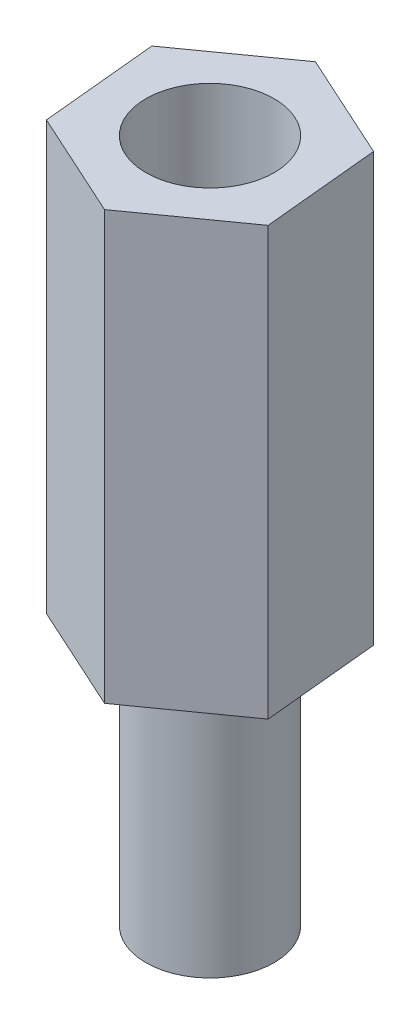
ISO-10303-21;
HEADER;
FILE_DESCRIPTION(('STEP AP214'),'2;1');
FILE_NAME('part.step','',(''),(''),'','','');
FILE_SCHEMA(('AUTOMOTIVE_DESIGN { 1 0 10303 214 1 1 1 1 }'));
ENDSEC;
DATA;
#1=APPLICATION_CONTEXT('core data for automotive mechanical design processes');
#2=APPLICATION_PROTOCOL_DEFINITION('international standard','automotive_design',2000,#1);
#3=PRODUCT_CONTEXT('',#1,'mechanical');
#4=PRODUCT('Part','Part','',(#3));
#5=PRODUCT_RELATED_PRODUCT_CATEGORY('part','',(#4));
#6=PRODUCT_DEFINITION_FORMATION('','',#4);
#7=PRODUCT_DEFINITION_CONTEXT('part definition',#1,'design');
#8=PRODUCT_DEFINITION('design','',#6,#7);
#9=PRODUCT_DEFINITION_SHAPE('','',#8);
#10=(LENGTH_UNIT() NAMED_UNIT(*) SI_UNIT(.MILLI.,.METRE.));
#11=(NAMED_UNIT(*) PLANE_ANGLE_UNIT() SI_UNIT($,.RADIAN.));
#12=(NAMED_UNIT(*) SI_UNIT($,.STERADIAN.) SOLID_ANGLE_UNIT());
#13=UNCERTAINTY_MEASURE_WITH_UNIT(LENGTH_MEASURE(1.E-05),#10,'distance_accuracy_value','');
#14=(GEOMETRIC_REPRESENTATION_CONTEXT(3) GLOBAL_UNCERTAINTY_ASSIGNED_CONTEXT((#13)) GLOBAL_UNIT_ASSIGNED_CONTEXT((#10,
#11,#12)) REPRESENTATION_CONTEXT('',''));
#15=CARTESIAN_POINT('',(0.,0.,0.));
#16=DIRECTION('',(0.,0.,1.));
#17=DIRECTION('',(1.,0.,0.));
#18=AXIS2_PLACEMENT_3D('',#15,#16,#17);
#19=CARTESIAN_POINT('',(0.,6.,0.));
#20=DIRECTION('',(0.,-1.,0.));
#21=DIRECTION('',(0.,0.,-1.));
#22=AXIS2_PLACEMENT_3D('',#19,#20,#21);
#23=CYLINDRICAL_SURFACE('',#22,1.5);
#24=CARTESIAN_POINT('',(0.,6.,0.));
#25=DIRECTION('',(0.,1.,0.));
#26=DIRECTION('',(0.,0.,1.));
#27=AXIS2_PLACEMENT_3D('',#24,#25,#26);
#28=CIRCLE('',#27,1.5);
#29=CARTESIAN_POINT('',(0.,6.,1.5));
#30=VERTEX_POINT('',#29);
#31=EDGE_CURVE('E11',#30,#30,#28,.T.);
#32=ORIENTED_EDGE('',*,*,#31,.F.);
#33=EDGE_LOOP('',(#32));
#34=FACE_BOUND('',#33,.T.);
#35=CARTESIAN_POINT('',(0.,0.,0.));
#36=DIRECTION('',(0.,1.,0.));
#37=DIRECTION('',(0.,0.,1.));
#38=AXIS2_PLACEMENT_3D('',#35,#36,#37);
#39=CIRCLE('',#38,1.5);
#40=CARTESIAN_POINT('',(0.,0.,1.5));
#41=VERTEX_POINT('',#40);
#42=EDGE_CURVE('E38',#41,#41,#39,.T.);
#43=ORIENTED_EDGE('',*,*,#42,.T.);
#44=EDGE_LOOP('',(#43));
#45=FACE_BOUND('',#44,.T.);
#46=ADVANCED_FACE('F35',(#34,#45),#23,.T.);
#47=CARTESIAN_POINT('',(0.,0.,0.));
#48=DIRECTION('',(0.,1.,0.));
#49=DIRECTION('',(0.,0.,1.));
#50=AXIS2_PLACEMENT_3D('',#47,#48,#49);
#51=PLANE('',#50);
#52=ORIENTED_EDGE('',*,*,#42,.F.);
#53=EDGE_LOOP('',(#52));
#54=FACE_BOUND('',#53,.T.);
#55=ADVANCED_FACE('F144',(#54),#51,.F.);
#56=CARTESIAN_POINT('',(0.26355456320684,16.,2.72972019180468));
#57=DIRECTION('',(-0.580913447607673,0.,-0.813965334881386));
#58=DIRECTION('',(-0.813965334881386,0.,0.580913447607673));
#59=AXIS2_PLACEMENT_3D('',#56,#57,#58);
#60=PLANE('',#59);
#61=DIRECTION('',(0.813965334881386,0.,-0.580913447607673));
#62=VECTOR('',#61,1.);
#63=CARTESIAN_POINT('',(0.26355456320684,6.,2.72972019180468));
#64=LINE('',#63,#62);
#65=CARTESIAN_POINT('',(0.26355456320684,6.,2.72972019180468));
#66=VERTEX_POINT('',#65);
#67=CARTESIAN_POINT('',(2.4957843129296,6.,1.1366151488819));
#68=VERTEX_POINT('',#67);
#69=EDGE_CURVE('E120',#66,#68,#64,.T.);
#70=ORIENTED_EDGE('',*,*,#69,.T.);
#71=DIRECTION('',(0.,-1.,0.));
#72=VECTOR('',#71,1.);
#73=CARTESIAN_POINT('',(2.4957843129296,16.,1.1366151488819));
#74=LINE('',#73,#72);
#75=CARTESIAN_POINT('',(2.4957843129296,16.,1.1366151488819));
#76=VERTEX_POINT('',#75);
#77=EDGE_CURVE('E138',#76,#68,#74,.T.);
#78=ORIENTED_EDGE('',*,*,#77,.F.);
#79=DIRECTION('',(0.813965334881386,0.,-0.580913447607673));
#80=VECTOR('',#79,1.);
#81=CARTESIAN_POINT('',(0.26355456320684,16.,2.72972019180468));
#82=LINE('',#81,#80);
#83=CARTESIAN_POINT('',(0.26355456320684,16.,2.72972019180468));
#84=VERTEX_POINT('',#83);
#85=EDGE_CURVE('E131',#84,#76,#82,.T.);
#86=ORIENTED_EDGE('',*,*,#85,.F.);
#87=DIRECTION('',(0.,-1.,0.));
#88=VECTOR('',#87,1.);
#89=CARTESIAN_POINT('',(0.26355456320684,16.,2.72972019180468));
#90=LINE('',#89,#88);
#91=EDGE_CURVE('E116',#84,#66,#90,.T.);
#92=ORIENTED_EDGE('',*,*,#91,.T.);
#93=EDGE_LOOP('',(#70,#78,#86,#92));
#94=FACE_BOUND('',#93,.T.);
#95=ADVANCED_FACE('F146',(#94),#60,.F.);
#96=CARTESIAN_POINT('',(2.4957843129296,16.,1.1366151488819));
#97=DIRECTION('',(-0.995371381611025,0.,0.0961031355875517));
#98=DIRECTION('',(0.0961031355875517,0.,0.995371381611025));
#99=AXIS2_PLACEMENT_3D('',#96,#97,#98);
#100=PLANE('',#99);
#101=DIRECTION('',(-0.0961031355875517,0.,-0.995371381611025));
#102=VECTOR('',#101,1.);
#103=CARTESIAN_POINT('',(2.4957843129296,6.,1.1366151488819));
#104=LINE('',#103,#102);
#105=CARTESIAN_POINT('',(2.23222974972276,6.,-1.59310504292278));
#106=VERTEX_POINT('',#105);
#107=EDGE_CURVE('E123',#68,#106,#104,.T.);
#108=ORIENTED_EDGE('',*,*,#107,.T.);
#109=DIRECTION('',(0.,-1.,0.));
#110=VECTOR('',#109,1.);
#111=CARTESIAN_POINT('',(2.23222974972276,16.,-1.59310504292278));
#112=LINE('',#111,#110);
#113=CARTESIAN_POINT('',(2.23222974972276,16.,-1.59310504292278));
#114=VERTEX_POINT('',#113);
#115=EDGE_CURVE('E135',#114,#106,#112,.T.);
#116=ORIENTED_EDGE('',*,*,#115,.F.);
#117=DIRECTION('',(-0.0961031355875517,0.,-0.995371381611025));
#118=VECTOR('',#117,1.);
#119=CARTESIAN_POINT('',(2.4957843129296,16.,1.1366151488819));
#120=LINE('',#119,#118);
#121=EDGE_CURVE('E89',#76,#114,#120,.T.);
#122=ORIENTED_EDGE('',*,*,#121,.F.);
#123=ORIENTED_EDGE('',*,*,#77,.T.);
#124=EDGE_LOOP('',(#108,#116,#122,#123));
#125=FACE_BOUND('',#124,.T.);
#126=ADVANCED_FACE('F151',(#125),#100,.F.);
#127=CARTESIAN_POINT('',(2.23222974972276,16.,-1.59310504292278));
#128=DIRECTION('',(-0.414457934003352,0.,0.910068470468938));
#129=DIRECTION('',(0.910068470468938,0.,0.414457934003352));
#130=AXIS2_PLACEMENT_3D('',#127,#128,#129);
#131=PLANE('',#130);
#132=DIRECTION('',(-0.910068470468938,0.,-0.414457934003352));
#133=VECTOR('',#132,1.);
#134=CARTESIAN_POINT('',(2.23222974972276,6.,-1.59310504292278));
#135=LINE('',#134,#133);
#136=CARTESIAN_POINT('',(-0.263554563206841,6.,-2.72972019180468));
#137=VERTEX_POINT('',#136);
#138=EDGE_CURVE('E126',#106,#137,#135,.T.);
#139=ORIENTED_EDGE('',*,*,#138,.T.);
#140=DIRECTION('',(0.,-1.,0.));
#141=VECTOR('',#140,1.);
#142=CARTESIAN_POINT('',(-0.263554563206841,16.,-2.72972019180468));
#143=LINE('',#142,#141);
#144=CARTESIAN_POINT('',(-0.263554563206841,16.,-2.72972019180468));
#145=VERTEX_POINT('',#144);
#146=EDGE_CURVE('E111',#145,#137,#143,.T.);
#147=ORIENTED_EDGE('',*,*,#146,.F.);
#148=DIRECTION('',(-0.910068470468938,0.,-0.414457934003352));
#149=VECTOR('',#148,1.);
#150=CARTESIAN_POINT('',(2.23222974972276,16.,-1.59310504292278));
#151=LINE('',#150,#149);
#152=EDGE_CURVE('E102',#114,#145,#151,.T.);
#153=ORIENTED_EDGE('',*,*,#152,.F.);
#154=ORIENTED_EDGE('',*,*,#115,.T.);
#155=EDGE_LOOP('',(#139,#147,#153,#154));
#156=FACE_BOUND('',#155,.T.);
#157=ADVANCED_FACE('F158',(#156),#131,.F.);
#158=CARTESIAN_POINT('',(-0.263554563206841,16.,-2.72972019180468));
#159=DIRECTION('',(0.580913447607673,0.,0.813965334881387));
#160=DIRECTION('',(0.813965334881387,0.,-0.580913447607673));
#161=AXIS2_PLACEMENT_3D('',#158,#159,#160);
#162=PLANE('',#161);
#163=DIRECTION('',(-0.813965334881386,0.,0.580913447607673));
#164=VECTOR('',#163,1.);
#165=CARTESIAN_POINT('',(-0.263554563206841,6.,-2.72972019180468));
#166=LINE('',#165,#164);
#167=CARTESIAN_POINT('',(-2.4957843129296,6.,-1.1366151488819));
#168=VERTEX_POINT('',#167);
#169=EDGE_CURVE('E110',#137,#168,#166,.T.);
#170=ORIENTED_EDGE('',*,*,#169,.T.);
#171=DIRECTION('',(0.,-1.,0.));
#172=VECTOR('',#171,1.);
#173=CARTESIAN_POINT('',(-2.4957843129296,16.,-1.1366151488819));
#174=LINE('',#173,#172);
#175=CARTESIAN_POINT('',(-2.4957843129296,16.,-1.1366151488819));
#176=VERTEX_POINT('',#175);
#177=EDGE_CURVE('E107',#176,#168,#174,.T.);
#178=ORIENTED_EDGE('',*,*,#177,.F.);
#179=DIRECTION('',(-0.813965334881386,0.,0.580913447607673));
#180=VECTOR('',#179,1.);
#181=CARTESIAN_POINT('',(-0.263554563206841,16.,-2.72972019180468));
#182=LINE('',#181,#180);
#183=EDGE_CURVE('E96',#145,#176,#182,.T.);
#184=ORIENTED_EDGE('',*,*,#183,.F.);
#185=ORIENTED_EDGE('',*,*,#146,.T.);
#186=EDGE_LOOP('',(#170,#178,#184,#185));
#187=FACE_BOUND('',#186,.T.);
#188=ADVANCED_FACE('F108',(#187),#162,.F.);
#189=CARTESIAN_POINT('',(-2.4957843129296,16.,-1.1366151488819));
#190=DIRECTION('',(0.995371381611025,0.,-0.0961031355875518));
#191=DIRECTION('',(-0.0961031355875518,0.,-0.995371381611025));
#192=AXIS2_PLACEMENT_3D('',#189,#190,#191);
#193=PLANE('',#192);
#194=DIRECTION('',(0.0961031355875518,0.,0.995371381611025));
#195=VECTOR('',#194,1.);
#196=CARTESIAN_POINT('',(-2.4957843129296,6.,-1.1366151488819));
#197=LINE('',#196,#195);
#198=CARTESIAN_POINT('',(-2.23222974972276,6.,1.59310504292278));
#199=VERTEX_POINT('',#198);
#200=EDGE_CURVE('E74',#168,#199,#197,.T.);
#201=ORIENTED_EDGE('',*,*,#200,.T.);
#202=DIRECTION('',(0.,-1.,0.));
#203=VECTOR('',#202,1.);
#204=CARTESIAN_POINT('',(-2.23222974972276,16.,1.59310504292278));
#205=LINE('',#204,#203);
#206=CARTESIAN_POINT('',(-2.23222974972276,16.,1.59310504292278));
#207=VERTEX_POINT('',#206);
#208=EDGE_CURVE('E112',#207,#199,#205,.T.);
#209=ORIENTED_EDGE('',*,*,#208,.F.);
#210=DIRECTION('',(0.0961031355875518,0.,0.995371381611025));
#211=VECTOR('',#210,1.);
#212=CARTESIAN_POINT('',(-2.4957843129296,16.,-1.1366151488819));
#213=LINE('',#212,#211);
#214=EDGE_CURVE('E100',#176,#207,#213,.T.);
#215=ORIENTED_EDGE('',*,*,#214,.F.);
#216=ORIENTED_EDGE('',*,*,#177,.T.);
#217=EDGE_LOOP('',(#201,#209,#215,#216));
#218=FACE_BOUND('',#217,.T.);
#219=ADVANCED_FACE('F114',(#218),#193,.F.);
#220=CARTESIAN_POINT('',(-2.23222974972276,16.,1.59310504292278));
#221=DIRECTION('',(0.414457934003352,0.,-0.910068470468938));
#222=DIRECTION('',(-0.910068470468938,0.,-0.414457934003352));
#223=AXIS2_PLACEMENT_3D('',#220,#221,#222);
#224=PLANE('',#223);
#225=DIRECTION('',(0.910068470468938,0.,0.414457934003352));
#226=VECTOR('',#225,1.);
#227=CARTESIAN_POINT('',(-2.23222974972276,6.,1.59310504292278));
#228=LINE('',#227,#226);
#229=EDGE_CURVE('E80',#199,#66,#228,.T.);
#230=ORIENTED_EDGE('',*,*,#229,.T.);
#231=ORIENTED_EDGE('',*,*,#91,.F.);
#232=DIRECTION('',(0.910068470468938,0.,0.414457934003352));
#233=VECTOR('',#232,1.);
#234=CARTESIAN_POINT('',(-2.23222974972276,16.,1.59310504292278));
#235=LINE('',#234,#233);
#236=EDGE_CURVE('E51',#207,#84,#235,.T.);
#237=ORIENTED_EDGE('',*,*,#236,.F.);
#238=ORIENTED_EDGE('',*,*,#208,.T.);
#239=EDGE_LOOP('',(#230,#231,#237,#238));
#240=FACE_BOUND('',#239,.T.);
#241=ADVANCED_FACE('F166',(#240),#224,.F.);
#242=CARTESIAN_POINT('',(0.,16.,0.));
#243=DIRECTION('',(0.,1.,0.));
#244=DIRECTION('',(0.,0.,1.));
#245=AXIS2_PLACEMENT_3D('',#242,#243,#244);
#246=PLANE('',#245);
#247=CARTESIAN_POINT('',(0.,16.,0.));
#248=DIRECTION('',(0.,1.,0.));
#249=DIRECTION('',(0.,0.,1.));
#250=AXIS2_PLACEMENT_3D('',#247,#248,#249);
#251=CIRCLE('',#250,1.5);
#252=CARTESIAN_POINT('',(0.,16.,1.5));
#253=VERTEX_POINT('',#252);
#254=EDGE_CURVE('E187',#253,#253,#251,.T.);
#255=ORIENTED_EDGE('',*,*,#254,.F.);
#256=EDGE_LOOP('',(#255));
#257=FACE_BOUND('',#256,.T.);
#258=ORIENTED_EDGE('',*,*,#85,.T.);
#259=ORIENTED_EDGE('',*,*,#121,.T.);
#260=ORIENTED_EDGE('',*,*,#152,.T.);
#261=ORIENTED_EDGE('',*,*,#183,.T.);
#262=ORIENTED_EDGE('',*,*,#214,.T.);
#263=ORIENTED_EDGE('',*,*,#236,.T.);
#264=EDGE_LOOP('',(#258,#259,#260,#261,#262,#263));
#265=FACE_BOUND('',#264,.T.);
#266=ADVANCED_FACE('F98',(#257,#265),#246,.T.);
#267=CARTESIAN_POINT('',(0.,6.,0.));
#268=DIRECTION('',(0.,1.,0.));
#269=DIRECTION('',(0.,0.,1.));
#270=AXIS2_PLACEMENT_3D('',#267,#268,#269);
#271=PLANE('',#270);
#272=ORIENTED_EDGE('',*,*,#31,.T.);
#273=EDGE_LOOP('',(#272));
#274=FACE_BOUND('',#273,.T.);
#275=ORIENTED_EDGE('',*,*,#69,.F.);
#276=ORIENTED_EDGE('',*,*,#229,.F.);
#277=ORIENTED_EDGE('',*,*,#200,.F.);
#278=ORIENTED_EDGE('',*,*,#169,.F.);
#279=ORIENTED_EDGE('',*,*,#138,.F.);
#280=ORIENTED_EDGE('',*,*,#107,.F.);
#281=EDGE_LOOP('',(#275,#276,#277,#278,#279,#280));
#282=FACE_BOUND('',#281,.T.);
#283=ADVANCED_FACE('F169',(#274,#282),#271,.F.);
#284=CARTESIAN_POINT('',(0.,11.,0.));
#285=DIRECTION('',(0.,1.,0.));
#286=DIRECTION('',(0.,0.,1.));
#287=AXIS2_PLACEMENT_3D('',#284,#285,#286);
#288=CYLINDRICAL_SURFACE('',#287,1.5);
#289=CARTESIAN_POINT('',(0.,11.,0.));
#290=DIRECTION('',(0.,1.,0.));
#291=DIRECTION('',(0.,0.,1.));
#292=AXIS2_PLACEMENT_3D('',#289,#290,#291);
#293=CIRCLE('',#292,1.5);
#294=CARTESIAN_POINT('',(0.,11.,1.5));
#295=VERTEX_POINT('',#294);
#296=EDGE_CURVE('E124',#295,#295,#293,.T.);
#297=ORIENTED_EDGE('',*,*,#296,.F.);
#298=EDGE_LOOP('',(#297));
#299=FACE_BOUND('',#298,.T.);
#300=ORIENTED_EDGE('',*,*,#254,.T.);
#301=EDGE_LOOP('',(#300));
#302=FACE_BOUND('',#301,.T.);
#303=ADVANCED_FACE('F172',(#299,#302),#288,.F.);
#304=CARTESIAN_POINT('',(0.,11.,0.));
#305=DIRECTION('',(0.,1.,0.));
#306=DIRECTION('',(0.,0.,1.));
#307=AXIS2_PLACEMENT_3D('',#304,#305,#306);
#308=PLANE('',#307);
#309=ORIENTED_EDGE('',*,*,#296,.T.);
#310=EDGE_LOOP('',(#309));
#311=FACE_BOUND('',#310,.T.);
#312=ADVANCED_FACE('F179',(#311),#308,.T.);
#313=CLOSED_SHELL('',(#46,#55,#95,#126,#157,#188,#219,#241,#266,#283,#303,#312));
#314=MANIFOLD_SOLID_BREP('B2',#313);
#315=ADVANCED_BREP_SHAPE_REPRESENTATION('',(#18,#314),#14);
#316=SHAPE_DEFINITION_REPRESENTATION(#9,#315);
ENDSEC;
END-ISO-10303-21;
